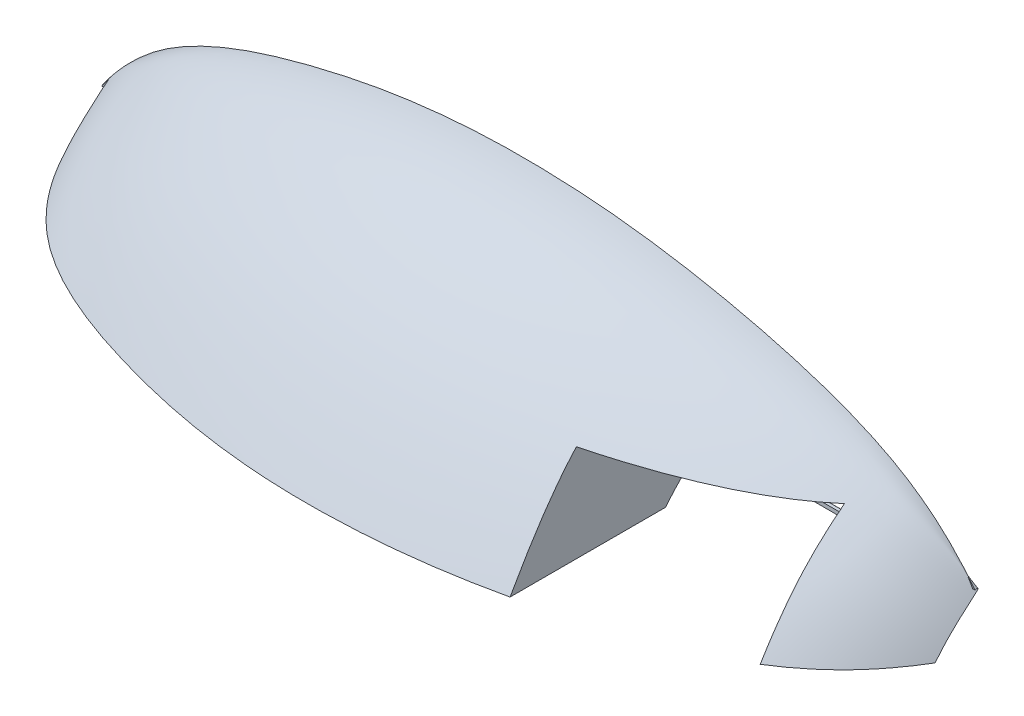
ISO-10303-21;
HEADER;
FILE_DESCRIPTION(('STEP AP214'),'2;1');
FILE_NAME('part.step','',(''),(''),'','','');
FILE_SCHEMA(('AUTOMOTIVE_DESIGN { 1 0 10303 214 1 1 1 1 }'));
ENDSEC;
DATA;
#1=APPLICATION_CONTEXT('core data for automotive mechanical design processes');
#2=APPLICATION_PROTOCOL_DEFINITION('international standard','automotive_design',2000,#1);
#3=PRODUCT_CONTEXT('',#1,'mechanical');
#4=PRODUCT('Part','Part','',(#3));
#5=PRODUCT_RELATED_PRODUCT_CATEGORY('part','',(#4));
#6=PRODUCT_DEFINITION_FORMATION('','',#4);
#7=PRODUCT_DEFINITION_CONTEXT('part definition',#1,'design');
#8=PRODUCT_DEFINITION('design','',#6,#7);
#9=PRODUCT_DEFINITION_SHAPE('','',#8);
#10=(LENGTH_UNIT() NAMED_UNIT(*) SI_UNIT(.MILLI.,.METRE.));
#11=(NAMED_UNIT(*) PLANE_ANGLE_UNIT() SI_UNIT($,.RADIAN.));
#12=(NAMED_UNIT(*) SI_UNIT($,.STERADIAN.) SOLID_ANGLE_UNIT());
#13=UNCERTAINTY_MEASURE_WITH_UNIT(LENGTH_MEASURE(1.E-05),#10,'distance_accuracy_value','');
#14=(GEOMETRIC_REPRESENTATION_CONTEXT(3) GLOBAL_UNCERTAINTY_ASSIGNED_CONTEXT((#13)) GLOBAL_UNIT_ASSIGNED_CONTEXT((#10,
#11,#12)) REPRESENTATION_CONTEXT('',''));
#15=CARTESIAN_POINT('',(0.,0.,0.));
#16=DIRECTION('',(0.,0.,1.));
#17=DIRECTION('',(1.,0.,0.));
#18=AXIS2_PLACEMENT_3D('',#15,#16,#17);
#19=CARTESIAN_POINT('',(20.25011525,25.453580483249,42.));
#20=DIRECTION('',(0.,0.,-1.));
#21=DIRECTION('',(-1.,0.,0.));
#22=AXIS2_PLACEMENT_3D('',#19,#20,#21);
#23=PLANE('',#22);
#24=DIRECTION('',(-1.,0.,0.));
#25=VECTOR('',#24,1.);
#26=CARTESIAN_POINT('',(36.5,24.5,42.));
#27=LINE('',#26,#25);
#28=CARTESIAN_POINT('',(36.5,24.5,42.));
#29=VERTEX_POINT('',#28);
#30=CARTESIAN_POINT('',(28.,24.5,42.));
#31=VERTEX_POINT('',#30);
#32=EDGE_CURVE('E36',#29,#31,#27,.T.);
#33=ORIENTED_EDGE('',*,*,#32,.T.);
#34=DIRECTION('',(0.,-1.,0.));
#35=VECTOR('',#34,1.);
#36=CARTESIAN_POINT('',(28.,24.5,42.));
#37=LINE('',#36,#35);
#38=CARTESIAN_POINT('',(28.,22.,42.));
#39=VERTEX_POINT('',#38);
#40=EDGE_CURVE('E95',#31,#39,#37,.T.);
#41=ORIENTED_EDGE('',*,*,#40,.T.);
#42=CARTESIAN_POINT('',(0.000230500000000689,22.,42.));
#43=CARTESIAN_POINT('',(13.5001536666667,22.,42.));
#44=CARTESIAN_POINT('',(27.0000768333334,22.,42.));
#45=CARTESIAN_POINT('',(40.5,22.,42.));
#46=B_SPLINE_CURVE_WITH_KNOTS('',3,(#42,#43,#44,#45),.UNSPECIFIED.,.F.,.F.,(4,4),(0.,1.),.UNSPECIFIED.);
#47=CARTESIAN_POINT('',(0.000230500000000689,22.,42.));
#48=VERTEX_POINT('',#47);
#49=EDGE_CURVE('E242',#48,#39,#46,.T.);
#50=ORIENTED_EDGE('',*,*,#49,.F.);
#51=CARTESIAN_POINT('',(40.5,22.,42.));
#52=CARTESIAN_POINT('',(39.5504796655932,23.244792146525,42.));
#53=CARTESIAN_POINT('',(36.7942535663366,25.8303513659763,42.));
#54=CARTESIAN_POINT('',(28.4856403512339,28.2163806083618,42.));
#55=CARTESIAN_POINT('',(19.7044952136281,29.2399964366831,42.));
#56=CARTESIAN_POINT('',(11.4702662698805,28.4720776969719,42.));
#57=CARTESIAN_POINT('',(3.12649338618059,25.6439685121812,42.));
#58=CARTESIAN_POINT('',(0.739150769022203,23.03726321863,42.));
#59=CARTESIAN_POINT('',(0.000230500000000689,22.,42.));
#60=B_SPLINE_CURVE_WITH_KNOTS('',3,(#51,#52,#53,#54,#55,#56,#57,#58,#59),.UNSPECIFIED.,.F.,.F.,
(4,1,1,1,1,1,4),(0.,0.118232225960158,0.285413594584941,0.470487289443813,0.74940048760547,
0.912101409043602,1.),.UNSPECIFIED.);
#61=CARTESIAN_POINT('',(40.5,22.,42.));
#62=VERTEX_POINT('',#61);
#63=EDGE_CURVE('E254',#62,#48,#60,.T.);
#64=ORIENTED_EDGE('',*,*,#63,.F.);
#65=CARTESIAN_POINT('',(0.000230500000000689,22.,42.));
#66=CARTESIAN_POINT('',(13.5001536666667,22.,42.));
#67=CARTESIAN_POINT('',(27.0000768333334,22.,42.));
#68=CARTESIAN_POINT('',(40.5,22.,42.));
#69=B_SPLINE_CURVE_WITH_KNOTS('',3,(#65,#66,#67,#68),.UNSPECIFIED.,.F.,.F.,(4,4),(0.,1.),.UNSPECIFIED.);
#70=CARTESIAN_POINT('',(36.5,22.,42.));
#71=VERTEX_POINT('',#70);
#72=EDGE_CURVE('E228',#71,#62,#69,.T.);
#73=ORIENTED_EDGE('',*,*,#72,.F.);
#74=DIRECTION('',(0.,-1.,0.));
#75=VECTOR('',#74,1.);
#76=CARTESIAN_POINT('',(36.5,24.5,42.));
#77=LINE('',#76,#75);
#78=EDGE_CURVE('E115',#29,#71,#77,.T.);
#79=ORIENTED_EDGE('',*,*,#78,.F.);
#80=EDGE_LOOP('',(#33,#41,#50,#64,#73,#79));
#81=FACE_BOUND('',#80,.T.);
#82=ADVANCED_FACE('F17',(#81),#23,.T.);
#83=CARTESIAN_POINT('',(0.,20.,12.));
#84=DIRECTION('',(0.,1.,0.));
#85=DIRECTION('',(0.,0.,-1.));
#86=AXIS2_PLACEMENT_3D('',#83,#84,#85);
#87=PLANE('',#86);
#88=DIRECTION('',(1.,0.,0.));
#89=VECTOR('',#88,1.);
#90=CARTESIAN_POINT('',(20.2501152496914,20.,43.8493692487917));
#91=LINE('',#90,#89);
#92=CARTESIAN_POINT('',(28.,20.,43.8493692519278));
#93=VERTEX_POINT('',#92);
#94=CARTESIAN_POINT('',(0.000230497181969574,20.,43.8493692487917));
#95=VERTEX_POINT('',#94);
#96=EDGE_CURVE('E310',#93,#95,#91,.F.);
#97=ORIENTED_EDGE('',*,*,#96,.F.);
#98=DIRECTION('',(0.,0.,1.));
#99=VECTOR('',#98,1.);
#100=CARTESIAN_POINT('',(28.,20.,42.));
#101=LINE('',#100,#99);
#102=CARTESIAN_POINT('',(28.,20.,51.0596281540542));
#103=VERTEX_POINT('',#102);
#104=EDGE_CURVE('E126',#93,#103,#101,.T.);
#105=ORIENTED_EDGE('',*,*,#104,.T.);
#106=CARTESIAN_POINT('',(20.2499996759147,20.0000000013567,52.0000000049307));
#107=CARTESIAN_POINT('',(20.4135696746412,20.0000000004872,51.9967497914983));
#108=CARTESIAN_POINT('',(20.5771180638886,20.0000000001306,51.9924559585666));
#109=CARTESIAN_POINT('',(20.9041414794619,19.9999999998694,51.9818220456582));
#110=CARTESIAN_POINT('',(21.0676165085924,19.999999999965,51.9754820520442));
#111=CARTESIAN_POINT('',(21.394080035644,20.0000000000349,51.9608143578874));
#112=CARTESIAN_POINT('',(21.5570687510992,20.0000000000096,51.9524915211889));
#113=CARTESIAN_POINT('',(21.8829352655506,19.9999999999904,51.9337950110099));
#114=CARTESIAN_POINT('',(22.045813058499,19.9999999999964,51.9234212334876));
#115=CARTESIAN_POINT('',(22.6443034734853,20.0000000000097,51.8814582921747));
#116=CARTESIAN_POINT('',(23.0794874533759,20.0000000000026,51.8434524485877));
#117=CARTESIAN_POINT('',(23.9483532892997,19.9999999999974,51.7523037645477));
#118=CARTESIAN_POINT('',(24.3820347921042,19.9999999999993,51.6991575806347));
#119=CARTESIAN_POINT('',(25.2473626601567,20.0000000000007,51.5780378677264));
#120=CARTESIAN_POINT('',(25.6790088157183,20.0000000000002,51.5100628437112));
#121=CARTESIAN_POINT('',(26.5429974773256,19.9999999999998,51.3594301739964));
#122=CARTESIAN_POINT('',(26.9753218060837,20.,51.2766683392817));
#123=CARTESIAN_POINT('',(27.6216923645903,20.,51.1425168358771));
#124=CARTESIAN_POINT('',(27.8367919615758,20.,51.0961326472616));
#125=CARTESIAN_POINT('',(28.2662774748216,20.,51.0001565027755));
#126=CARTESIAN_POINT('',(28.4806633860763,20.,50.9505645244564));
#127=CARTESIAN_POINT('',(28.9086688754122,20.,50.8483505978863));
#128=CARTESIAN_POINT('',(29.1222885877608,20.,50.7957292111368));
#129=CARTESIAN_POINT('',(29.5487597240877,20.,50.6874701461041));
#130=CARTESIAN_POINT('',(29.7616111554705,20.,50.6318324969737));
#131=CARTESIAN_POINT('',(30.2960050616216,20.,50.487739101054));
#132=CARTESIAN_POINT('',(30.6169789561417,20.,50.3971586821497));
#133=CARTESIAN_POINT('',(31.2564301196012,20.,50.2075895642107));
#134=CARTESIAN_POINT('',(31.5749074742918,20.,50.1086011553682));
#135=CARTESIAN_POINT('',(32.2089280712393,20.,49.9010385501576));
#136=CARTESIAN_POINT('',(32.5244696365589,20.,49.7924592073451));
#137=CARTESIAN_POINT('',(33.1520803241271,20.,49.5642134618928));
#138=CARTESIAN_POINT('',(33.4641434940165,20.,49.4445305908881));
#139=CARTESIAN_POINT('',(34.0794529422012,20.,49.1939929876819));
#140=CARTESIAN_POINT('',(34.382759943791,20.,49.0632880839233));
#141=CARTESIAN_POINT('',(34.9827262165219,20.,48.7874415991884));
#142=CARTESIAN_POINT('',(35.2793871648631,20.,48.642303711976));
#143=CARTESIAN_POINT('',(35.7173590814869,20.,48.4119429065106));
#144=CARTESIAN_POINT('',(35.8620510940372,20.,48.3331245702984));
#145=CARTESIAN_POINT('',(36.1488126549921,20.,48.1708326440661));
#146=CARTESIAN_POINT('',(36.2908821824665,20.,48.0873590169129));
#147=CARTESIAN_POINT('',(36.5717250266479,20.,47.9154631703518));
#148=CARTESIAN_POINT('',(36.7105027599516,20.,47.8270481865198));
#149=CARTESIAN_POINT('',(36.9843642019698,20.,47.6446757523775));
#150=CARTESIAN_POINT('',(37.1194481985438,20.,47.5507187357799));
#151=CARTESIAN_POINT('',(37.3440146505783,20.,47.3874348648052));
#152=CARTESIAN_POINT('',(37.434567794721,20.,47.3195760319221));
#153=CARTESIAN_POINT('',(37.6136503259639,20.,47.1812446132004));
#154=CARTESIAN_POINT('',(37.7021797473371,20.,47.11077207168));
#155=CARTESIAN_POINT('',(37.9646618185038,20.,46.8954065446225));
#156=CARTESIAN_POINT('',(38.1354428078512,20.,46.7466131871385));
#157=CARTESIAN_POINT('',(38.4678317330362,20.,46.4390948371949));
#158=CARTESIAN_POINT('',(38.6294386012121,19.9999999999999,46.2803686932826));
#159=CARTESIAN_POINT('',(38.9430810707587,20.0000000000001,45.953570352726));
#160=CARTESIAN_POINT('',(39.0951117168919,20.0000000000003,45.7854934008313));
#161=CARTESIAN_POINT('',(39.3892421629384,19.9999999999997,45.4409125191117));
#162=CARTESIAN_POINT('',(39.5313430951607,19.999999999999,45.2644095540016));
#163=CARTESIAN_POINT('',(39.8055523366811,20.000000000001,44.9039472757448));
#164=CARTESIAN_POINT('',(39.9376655491683,20.0000000000037,44.7199916902775));
#165=CARTESIAN_POINT('',(40.1409119593444,19.9999999999978,44.4209696077206));
#166=CARTESIAN_POINT('',(40.2151684471049,19.9999999999932,44.3080086183198));
#167=CARTESIAN_POINT('',(40.3601614020383,20.0000000000068,44.0801467760643));
#168=CARTESIAN_POINT('',(40.4309042188433,20.0000000000248,43.9652499653502));
#169=CARTESIAN_POINT('',(40.4999999996914,20.0000000000678,43.849369255064));
#170=B_SPLINE_CURVE_WITH_KNOTS('',3,(#106,#107,#108,#109,#110,#111,#112,#113,#114,#115,#116,
#117,#118,#119,#120,#121,#122,#123,#124,#125,#126,#127,#128,#129,#130,#131,#132,#133,#134,#135,
#136,#137,#138,#139,#140,#141,#142,#143,#144,#145,#146,#147,#148,#149,#150,#151,#152,#153,#154,
#155,#156,#157,#158,#159,#160,#161,#162,#163,#164,#165,#166,#167,#168,#169),.UNSPECIFIED.,.F.,
.F.,(4,2,2,2,2,2,2,2,2,2,2,2,2,2,2,2,2,2,2,2,2,2,2,2,2,2,2,2,2,2,2,4),(0.,0.490802083132261,
0.981583453588453,1.4711731299124,1.96078764890766,3.27101832903677,4.58153857361369,
5.89219100385777,7.21247135862331,7.87258316302662,8.53269958744197,9.19269405059586,
9.85268213590522,10.8531062033214,11.8534957562505,12.8544254123247,13.856864097763,
14.8473784102302,15.8376398743658,16.3318703758224,16.8261048200745,17.3196336149218,
17.8131238379323,18.1525511005949,18.4919726105563,19.1710579572135,19.8502221728125,
20.5297349843316,21.2091701825019,21.8882696354775,22.2937624549635,22.6984936428757),.UNSPECIFIED.);
#171=CARTESIAN_POINT('',(20.2540061646727,19.9999915980269,51.9999847320657));
#172=VERTEX_POINT('',#171);
#173=EDGE_CURVE('E277',#103,#172,#170,.F.);
#174=ORIENTED_EDGE('',*,*,#173,.T.);
#175=CARTESIAN_POINT('',(0.000230499716088509,16.6736548785001,45.9554175751034));
#176=CARTESIAN_POINT('',(0.739150768497569,17.1737420851977,46.8641682399041));
#177=CARTESIAN_POINT('',(3.12649338505101,18.4304915250546,49.1479137020203));
#178=CARTESIAN_POINT('',(11.4702662680946,19.7939846074181,51.6256320448502));
#179=CARTESIAN_POINT('',(19.704495211664,20.1642149708474,52.2984088813494));
#180=CARTESIAN_POINT('',(28.4856403495073,19.6707074695508,51.401614754483));
#181=CARTESIAN_POINT('',(36.7942535651638,18.5203507651671,49.3112045102972));
#182=CARTESIAN_POINT('',(39.5504796650203,17.273796309124,47.0459852136063));
#183=CARTESIAN_POINT('',(40.4999999997161,16.6736548830317,45.9554175833377));
#184=B_SPLINE_CURVE_WITH_KNOTS('',3,(#175,#176,#177,#178,#179,#180,#181,#182,#183),
.UNSPECIFIED.,.F.,.F.,(4,1,1,1,1,1,4),(0.,0.087898590956398,0.25059951239453,0.529512710556187,
0.714586405415059,0.881767774039842,1.),.UNSPECIFIED.);
#185=CARTESIAN_POINT('',(20.2499994144646,20.000008266416,52.0000150216021));
#186=VERTEX_POINT('',#185);
#187=EDGE_CURVE('E296',#172,#186,#184,.F.);
#188=ORIENTED_EDGE('',*,*,#187,.T.);
#189=DIRECTION('',(-1.,0.,0.));
#190=VECTOR('',#189,1.);
#191=CARTESIAN_POINT('',(40.5,20.,52.));
#192=LINE('',#191,#190);
#193=CARTESIAN_POINT('',(18.7835165493222,20.,52.));
#194=VERTEX_POINT('',#193);
#195=EDGE_CURVE('E185',#186,#194,#192,.T.);
#196=ORIENTED_EDGE('',*,*,#195,.T.);
#197=CARTESIAN_POINT('',(0.000230499691400271,20.0000000001187,43.8493692422752));
#198=CARTESIAN_POINT('',(0.0968054574181439,20.0000000000429,44.0227701845247));
#199=CARTESIAN_POINT('',(0.19661560293333,20.0000000000115,44.1943989615023));
#200=CARTESIAN_POINT('',(0.403397344412526,19.9999999999884,44.5339714085741));
#201=CARTESIAN_POINT('',(0.510389067584049,19.9999999999967,44.7019028071633));
#202=CARTESIAN_POINT('',(0.74366612102853,20.0000000000036,45.0508708897581));
#203=CARTESIAN_POINT('',(0.870785335727647,20.000000000001,45.2313529319335));
#204=CARTESIAN_POINT('',(1.13447983678024,19.999999999999,45.5853728902618));
#205=CARTESIAN_POINT('',(1.2710578603763,19.9999999999997,45.7589087731777));
#206=CARTESIAN_POINT('',(1.55390028108398,20.0000000000003,46.0978400677537));
#207=CARTESIAN_POINT('',(1.70016216897266,20.0000000000001,46.2632375689683));
#208=CARTESIAN_POINT('',(2.00231310557232,19.9999999999999,46.5845543006511));
#209=CARTESIAN_POINT('',(2.15818683469796,20.,46.7404878660588));
#210=CARTESIAN_POINT('',(2.39923233798985,20.,46.966653896673));
#211=CARTESIAN_POINT('',(2.48079624186092,20.,47.0407614236449));
#212=CARTESIAN_POINT('',(2.64630715917477,20.,47.1862707033638));
#213=CARTESIAN_POINT('',(2.73025416837889,20.,47.2576724609228));
#214=CARTESIAN_POINT('',(2.90035286327407,20.,47.3978067476822));
#215=CARTESIAN_POINT('',(2.98650468371042,20.,47.4665391130955));
#216=CARTESIAN_POINT('',(3.16081369194877,20.,47.6014075947693));
#217=CARTESIAN_POINT('',(3.24897090450148,20.,47.6675436789587));
#218=CARTESIAN_POINT('',(3.51873052954396,20.,47.8640268703432));
#219=CARTESIAN_POINT('',(3.70319722590761,20.,47.990463361658));
#220=CARTESIAN_POINT('',(4.0784207412309,20.,48.2337572998735));
#221=CARTESIAN_POINT('',(4.26918046570282,20.,48.3506102327003));
#222=CARTESIAN_POINT('',(4.65593172761846,20.,48.5755220889876));
#223=CARTESIAN_POINT('',(4.85192591195376,20.,48.6835764470487));
#224=CARTESIAN_POINT('',(5.24811020294785,20.,48.8915835274849));
#225=CARTESIAN_POINT('',(5.44829964198088,20.,48.9915375267988));
#226=CARTESIAN_POINT('',(5.85479183546584,20.,49.1853697493704));
#227=CARTESIAN_POINT('',(6.06114025297253,20.,49.2791518843283));
#228=CARTESIAN_POINT('',(6.47667009855311,20.,49.4598880855516));
#229=CARTESIAN_POINT('',(6.68585002941654,20.,49.5468456068719));
#230=CARTESIAN_POINT('',(7.10663958435005,20.,49.7146864317225));
#231=CARTESIAN_POINT('',(7.31824935329984,20.,49.7955693708633));
#232=CARTESIAN_POINT('',(7.74352382423458,20.,49.9519338687696));
#233=CARTESIAN_POINT('',(7.95718916212183,20.,50.0274136908321));
#234=CARTESIAN_POINT('',(8.46348647151599,20.,50.1999144380408));
#235=CARTESIAN_POINT('',(8.75681544455025,20.,50.2948904730871));
#236=CARTESIAN_POINT('',(9.19855335928451,20.,50.4318169607233));
#237=CARTESIAN_POINT('',(9.34611380961829,20.,50.4765429049414));
#238=CARTESIAN_POINT('',(9.64173131650181,20.,50.5643258119592));
#239=CARTESIAN_POINT('',(9.78978837156634,20.,50.6073827797455));
#240=CARTESIAN_POINT('',(10.0864275836054,20.,50.6917853473253));
#241=CARTESIAN_POINT('',(10.235009856952,20.,50.7331305381955));
#242=CARTESIAN_POINT('',(10.5326543868108,20.,50.8140517367445));
#243=CARTESIAN_POINT('',(10.6817166425207,20.,50.8536277473794));
#244=CARTESIAN_POINT('',(11.1296271508575,20.,50.9696357833914));
#245=CARTESIAN_POINT('',(11.4291866773501,20.,51.0433442580629));
#246=CARTESIAN_POINT('',(12.0300653756806,20.,51.1831356639743));
#247=CARTESIAN_POINT('',(12.3313844721009,20.,51.2492189195574));
#248=CARTESIAN_POINT('',(12.9356356389751,20.,51.3734430444445));
#249=CARTESIAN_POINT('',(13.2385675873632,20.,51.431584506174));
#250=CARTESIAN_POINT('',(13.8306128135457,20.,51.5369486507701));
#251=CARTESIAN_POINT('',(14.1196545285057,20.,51.5845735049844));
#252=CARTESIAN_POINT('',(14.6988398360051,20.,51.6722542257451));
#253=CARTESIAN_POINT('',(14.9889832530848,20.,51.7123112499061));
#254=CARTESIAN_POINT('',(15.5701877166188,20.,51.784759412013));
#255=CARTESIAN_POINT('',(15.8612486397586,20.,51.8171515390563));
#256=CARTESIAN_POINT('',(16.4440972396431,20.,51.874249569198));
#257=CARTESIAN_POINT('',(16.7358848494747,20.,51.8989561553886));
#258=CARTESIAN_POINT('',(17.3199872683331,20.,51.9407356879203));
#259=CARTESIAN_POINT('',(17.6123020455568,20.,51.9578090802453));
#260=CARTESIAN_POINT('',(18.1972543751203,20.,51.9844756855724));
#261=CARTESIAN_POINT('',(18.4898919054113,20.,51.9940693812599));
#262=CARTESIAN_POINT('',(18.7825989838568,20.,51.9999999896905));
#263=B_SPLINE_CURVE_WITH_KNOTS('',3,(#197,#198,#199,#200,#201,#202,#203,#204,#205,#206,#207,
#208,#209,#210,#211,#212,#213,#214,#215,#216,#217,#218,#219,#220,#221,#222,#223,#224,#225,#226,
#227,#228,#229,#230,#231,#232,#233,#234,#235,#236,#237,#238,#239,#240,#241,#242,#243,#244,#245,
#246,#247,#248,#249,#250,#251,#252,#253,#254,#255,#256,#257,#258,#259,#260,#261,#262),
.UNSPECIFIED.,.F.,.F.,(4,2,2,2,2,2,2,2,2,2,2,2,2,2,2,2,2,2,2,2,2,2,2,2,2,2,2,2,2,2,2,2,4),(0.,
0.59544499597196,1.19263473793595,1.8546102223042,2.51677807979466,3.17877502689578,
3.8397428520501,4.17030115964499,4.50085887933667,4.83143684927192,5.16201890144312,
5.83256820086974,6.50343155167097,7.17464081040931,7.84574405320231,8.52558795630373,
9.2050854285547,9.88462362859726,10.5643792782317,11.4892091908595,11.9517721093825,
12.4143336457536,12.8770050523883,13.339675685918,14.265055835568,15.1903966091216,
16.1156683182796,16.9943879264017,17.8729730119724,18.7514446608301,19.6298382086507,
20.5081804279195,21.3864659606422),.UNSPECIFIED.);
#264=EDGE_CURVE('E276',#194,#95,#263,.F.);
#265=ORIENTED_EDGE('',*,*,#264,.T.);
#266=EDGE_LOOP('',(#97,#105,#174,#188,#196,#265));
#267=FACE_BOUND('',#266,.T.);
#268=ADVANCED_FACE('F303',(#267),#87,.F.);
#269=CARTESIAN_POINT('',(20.2501152489146,18.3387013083919,48.9811139533019));
#270=DIRECTION('',(0.,0.876104202220531,-0.482121796698228));
#271=DIRECTION('',(-1.,-1.11891773624251E-10,-2.0331852867983E-10));
#272=AXIS2_PLACEMENT_3D('',#269,#270,#271);
#273=PLANE('',#272);
#274=CARTESIAN_POINT('',(0.000230499716088509,16.6736548785001,45.9554175751034));
#275=CARTESIAN_POINT('',(0.739150768497569,17.1737420851977,46.8641682399041));
#276=CARTESIAN_POINT('',(3.12649338505101,18.4304915250546,49.1479137020203));
#277=CARTESIAN_POINT('',(11.4702662680946,19.7939846074181,51.6256320448502));
#278=CARTESIAN_POINT('',(19.704495211664,20.1642149708474,52.2984088813494));
#279=CARTESIAN_POINT('',(28.4856403495073,19.6707074695508,51.401614754483));
#280=CARTESIAN_POINT('',(36.7942535651638,18.5203507651671,49.3112045102972));
#281=CARTESIAN_POINT('',(39.5504796650203,17.273796309124,47.0459852136063));
#282=CARTESIAN_POINT('',(40.4999999997161,16.6736548830317,45.9554175833377));
#283=B_SPLINE_CURVE_WITH_KNOTS('',3,(#274,#275,#276,#277,#278,#279,#280,#281,#282),
.UNSPECIFIED.,.F.,.F.,(4,1,1,1,1,1,4),(0.,0.087898590956398,0.25059951239453,0.529512710556187,
0.714586405415059,0.881767774039842,1.),.UNSPECIFIED.);
#284=EDGE_CURVE('E255',#194,#186,#283,.T.);
#285=ORIENTED_EDGE('',*,*,#284,.F.);
#286=ORIENTED_EDGE('',*,*,#195,.F.);
#287=EDGE_LOOP('',(#285,#286));
#288=FACE_BOUND('',#287,.T.);
#289=ADVANCED_FACE('F19',(#288),#273,.F.);
#290=CARTESIAN_POINT('',(0.000230500000000689,22.,42.));
#291=CARTESIAN_POINT('',(0.000230500000000652,22.,41.9948388900879));
#292=CARTESIAN_POINT('',(0.000230500163543397,22.1160702352584,41.6051916335395));
#293=CARTESIAN_POINT('',(0.000230499507954534,21.2652746975059,42.7053325517347));
#294=CARTESIAN_POINT('',(0.000230499770870856,19.8719744469128,44.0768283929599));
#295=CARTESIAN_POINT('',(0.000230499716082116,17.8853002770691,45.2886468245025));
#296=CARTESIAN_POINT('',(0.000230499716088509,16.6736548785001,45.9554175751034));
#297=CARTESIAN_POINT('',(13.5001536666667,22.,42.));
#298=CARTESIAN_POINT('',(13.5001536666667,22.,41.9948388928607));
#299=CARTESIAN_POINT('',(13.5001536668302,22.1160702342329,41.6051916397552));
#300=CARTESIAN_POINT('',(13.5001536661746,21.2652746983509,42.7053325555318));
#301=CARTESIAN_POINT('',(13.5001536664375,19.8719744494963,44.0768283950455));
#302=CARTESIAN_POINT('',(13.5001536663827,17.8853002785015,45.2886468272902));
#303=CARTESIAN_POINT('',(13.5001536663828,16.6736548800107,45.9554175778481));
#304=CARTESIAN_POINT('',(27.0000768333334,22.,42.));
#305=CARTESIAN_POINT('',(27.0000768333334,22.,41.9948388956336));
#306=CARTESIAN_POINT('',(27.0000768334969,22.1160702332072,41.6051916459709));
#307=CARTESIAN_POINT('',(27.0000768328413,21.2652746991957,42.7053325593288));
#308=CARTESIAN_POINT('',(27.0000768331042,19.8719744520799,44.0768283971311));
#309=CARTESIAN_POINT('',(27.0000768330494,17.885300279934,45.2886468300779));
#310=CARTESIAN_POINT('',(27.0000768330494,16.6736548815212,45.9554175805929));
#311=CARTESIAN_POINT('',(40.5,22.,42.));
#312=CARTESIAN_POINT('',(40.5,22.,41.9948388984064));
#313=CARTESIAN_POINT('',(40.5000000001636,22.1160702321816,41.6051916521867));
#314=CARTESIAN_POINT('',(40.4999999995079,21.2652747000406,42.7053325631259));
#315=CARTESIAN_POINT('',(40.4999999997708,19.8719744546634,44.0768283992168));
#316=CARTESIAN_POINT('',(40.4999999997161,17.8853002813665,45.2886468328657));
#317=CARTESIAN_POINT('',(40.4999999997161,16.6736548830317,45.9554175833377));
#318=B_SPLINE_SURFACE_WITH_KNOTS('',3,3,((#290,#291,#292,#293,#294,#295,#296),(#297,#298,#299,
#300,#301,#302,#303),(#304,#305,#306,#307,#308,#309,#310),(#311,#312,#313,#314,#315,#316,#317)),
.UNSPECIFIED.,.F.,.F.,.F.,(4,4),(4,1,1,1,4),(0.,1.),(0.,0.251024544191798,0.502049088383596,
0.789400842037647,1.),.UNSPECIFIED.);
#319=DIRECTION('',(1.,0.,0.));
#320=VECTOR('',#319,1.);
#321=CARTESIAN_POINT('',(20.2501152499384,21.8271332074617,41.9999999999972));
#322=LINE('',#321,#320);
#323=CARTESIAN_POINT('',(36.5,21.8271332074617,42.));
#324=VERTEX_POINT('',#323);
#325=CARTESIAN_POINT('',(28.,21.8271332074617,42.));
#326=VERTEX_POINT('',#325);
#327=EDGE_CURVE('E11',#324,#326,#322,.F.);
#328=CARTESIAN_POINT('',(28.,21.8271332099329,42.));
#329=CARTESIAN_POINT('',(28.,21.8128782732778,42.0157407648511));
#330=CARTESIAN_POINT('',(28.,21.7987474599328,42.0315921023192));
#331=CARTESIAN_POINT('',(28.,21.7706562873714,42.0634439358529));
#332=CARTESIAN_POINT('',(28.,21.7566959196322,42.0794444243893));
#333=CARTESIAN_POINT('',(28.,21.7149562268739,42.1275588052288));
#334=CARTESIAN_POINT('',(28.,21.6873137112087,42.1597907965044));
#335=CARTESIAN_POINT('',(28.,21.6321354739692,42.2243079644472));
#336=CARTESIAN_POINT('',(28.,21.6045996928564,42.2565930904632));
#337=CARTESIAN_POINT('',(28.,21.549474517407,42.3211241421989));
#338=CARTESIAN_POINT('',(28.,21.5218851170072,42.3533700627234));
#339=CARTESIAN_POINT('',(28.,21.4184539694683,42.4737061713376));
#340=CARTESIAN_POINT('',(28.,21.3421367508642,42.5613919989329));
#341=CARTESIAN_POINT('',(28.,21.1873286204282,42.7348281201358));
#342=CARTESIAN_POINT('',(28.,21.1088378418642,42.8205785318271));
#343=CARTESIAN_POINT('',(28.,20.9490418374781,42.9893857523519));
#344=CARTESIAN_POINT('',(28.,20.8677373078765,43.0724432178012));
#345=CARTESIAN_POINT('',(28.,20.7019766398885,43.2357364883653));
#346=CARTESIAN_POINT('',(28.,20.6175137729919,43.3159654680112));
#347=CARTESIAN_POINT('',(28.,20.4457213498983,43.4733924526511));
#348=CARTESIAN_POINT('',(28.,20.3583901109788,43.5505886179622));
#349=CARTESIAN_POINT('',(28.,20.181082448173,43.7021222546609));
#350=CARTESIAN_POINT('',(28.,20.0911027229197,43.7764558663558));
#351=CARTESIAN_POINT('',(28.,20.,43.849369251213));
#352=B_SPLINE_CURVE_WITH_KNOTS('',3,(#328,#329,#330,#331,#332,#333,#334,#335,#336,#337,#338,
#339,#340,#341,#342,#343,#344,#345,#346,#347,#348,#349,#350,#351),.UNSPECIFIED.,.F.,.F.,(4,2,2,
2,2,2,2,2,2,2,2,4),(0.,0.0637059523011469,0.127408705971284,0.254793421762433,0.382092066684013,
0.509406058250785,0.858123549760446,1.20681970743021,1.55543019381533,1.90483118819218,
2.2544409533805,2.60450668857241),.UNSPECIFIED.);
#353=EDGE_CURVE('E178',#326,#93,#352,.T.);
#354=CARTESIAN_POINT('',(0.000230500000000689,22.,42.));
#355=CARTESIAN_POINT('',(0.000230500000000652,22.,41.9948388900879));
#356=CARTESIAN_POINT('',(0.000230500163543397,22.1160702352584,41.6051916335395));
#357=CARTESIAN_POINT('',(0.000230499507954534,21.2652746975059,42.7053325517347));
#358=CARTESIAN_POINT('',(0.000230499770870856,19.8719744469128,44.0768283929599));
#359=CARTESIAN_POINT('',(0.000230499716082116,17.8853002770691,45.2886468245025));
#360=CARTESIAN_POINT('',(0.000230499716088509,16.6736548785001,45.9554175751034));
#361=B_SPLINE_CURVE_WITH_KNOTS('',3,(#354,#355,#356,#357,#358,#359,#360),.UNSPECIFIED.,.F.,.F.,
(4,1,1,1,4),(0.,0.251024544191798,0.502049088383596,0.789400842037647,1.),.UNSPECIFIED.);
#362=EDGE_CURVE('E247',#48,#95,#361,.T.);
#363=CARTESIAN_POINT('',(0.000230500000000689,22.,42.));
#364=CARTESIAN_POINT('',(13.5001536666667,22.,42.));
#365=CARTESIAN_POINT('',(27.0000768333334,22.,42.));
#366=CARTESIAN_POINT('',(40.5,22.,42.));
#367=B_SPLINE_CURVE_WITH_KNOTS('',3,(#363,#364,#365,#366),.UNSPECIFIED.,.F.,.F.,(4,4),(0.,1.),.UNSPECIFIED.);
#368=EDGE_CURVE('E221',#39,#71,#367,.T.);
#369=CARTESIAN_POINT('',(40.5,22.,42.));
#370=CARTESIAN_POINT('',(40.5,22.,41.9948388984064));
#371=CARTESIAN_POINT('',(40.5000000001636,22.1160702321816,41.6051916521867));
#372=CARTESIAN_POINT('',(40.4999999995079,21.2652747000406,42.7053325631259));
#373=CARTESIAN_POINT('',(40.4999999997708,19.8719744546634,44.0768283992168));
#374=CARTESIAN_POINT('',(40.4999999997161,17.8853002813665,45.2886468328657));
#375=CARTESIAN_POINT('',(40.4999999997161,16.6736548830317,45.9554175833377));
#376=B_SPLINE_CURVE_WITH_KNOTS('',3,(#369,#370,#371,#372,#373,#374,#375),.UNSPECIFIED.,.F.,.F.,
(4,1,1,1,4),(0.,0.251024544191798,0.502049088383596,0.789400842037647,1.),.UNSPECIFIED.);
#377=CARTESIAN_POINT('',(40.5,20.,43.849369255064));
#378=VERTEX_POINT('',#377);
#379=EDGE_CURVE('E267',#378,#62,#376,.F.);
#380=CARTESIAN_POINT('',(36.5,20.,43.8493692519278));
#381=VERTEX_POINT('',#380);
#382=EDGE_CURVE('E339',#378,#381,#91,.F.);
#383=CARTESIAN_POINT('',(36.5,19.9999999994958,43.8493692542721));
#384=CARTESIAN_POINT('',(36.5,20.0843239913893,43.7818768376772));
#385=CARTESIAN_POINT('',(36.5,20.1676877510825,43.7131716880926));
#386=CARTESIAN_POINT('',(36.5,20.3322817832901,43.5732122807683));
#387=CARTESIAN_POINT('',(36.5,20.4135115139621,43.5019573862764));
#388=CARTESIAN_POINT('',(36.5,20.5733451414434,43.357023299949));
#389=CARTESIAN_POINT('',(36.5,20.6519560928481,43.2833519001543));
#390=CARTESIAN_POINT('',(36.5,20.806647741807,43.1334004753126));
#391=CARTESIAN_POINT('',(36.5,20.8827284796048,43.0571204917948));
#392=CARTESIAN_POINT('',(36.5,21.0080461423206,42.9273667920294));
#393=CARTESIAN_POINT('',(36.5,21.0579634676359,42.8745473610282));
#394=CARTESIAN_POINT('',(36.5,21.1567672037968,42.7679427904414));
#395=CARTESIAN_POINT('',(36.5,21.2056534966466,42.7141575416136));
#396=CARTESIAN_POINT('',(36.5,21.3025849727241,42.6058156254657));
#397=CARTESIAN_POINT('',(36.5,21.3506299709092,42.5512587930898));
#398=CARTESIAN_POINT('',(36.5,21.446229945371,42.4414372319697));
#399=CARTESIAN_POINT('',(36.5,21.4937830674184,42.3861708944385));
#400=CARTESIAN_POINT('',(36.5,21.5648927702426,42.3030929298192));
#401=CARTESIAN_POINT('',(36.5,21.5885571610929,42.2753731057193));
#402=CARTESIAN_POINT('',(36.5,21.6358871322521,42.2199351134087));
#403=CARTESIAN_POINT('',(36.5,21.6595527125408,42.1922169451808));
#404=CARTESIAN_POINT('',(36.5,21.7069816342488,42.1368894935363));
#405=CARTESIAN_POINT('',(36.5,21.7307449168614,42.1092801599734));
#406=CARTESIAN_POINT('',(36.5,21.7666287287478,42.0680720890538));
#407=CARTESIAN_POINT('',(36.5,21.7786301424455,42.0543700185255));
#408=CARTESIAN_POINT('',(36.5,21.8027673733977,42.0270839075393));
#409=CARTESIAN_POINT('',(36.5,21.8149031962911,42.0134998720765));
#410=CARTESIAN_POINT('',(36.5,21.8271332126461,42.));
#411=B_SPLINE_CURVE_WITH_KNOTS('',3,(#383,#384,#385,#386,#387,#388,#389,#390,#391,#392,#393,
#394,#395,#396,#397,#398,#399,#400,#401,#402,#403,#404,#405,#406,#407,#408,#409,#410),
.UNSPECIFIED.,.F.,.F.,(4,2,2,2,2,2,2,2,2,2,2,2,2,4),(0.,0.324025692189053,0.648132876481427,
0.971281635804668,1.29442525294033,1.51243568410092,1.73047093139287,1.94855354791122,
2.16727684260258,2.27661825192343,2.38595819714988,2.49523988476984,2.54988368974165,
2.60452979597384),.UNSPECIFIED.);
#412=EDGE_CURVE('E147',#381,#324,#411,.T.);
#413=ORIENTED_EDGE('',*,*,#327,.T.);
#414=ORIENTED_EDGE('',*,*,#353,.T.);
#415=ORIENTED_EDGE('',*,*,#96,.T.);
#416=ORIENTED_EDGE('',*,*,#362,.F.);
#417=ORIENTED_EDGE('',*,*,#49,.T.);
#418=ORIENTED_EDGE('',*,*,#368,.T.);
#419=ORIENTED_EDGE('',*,*,#72,.T.);
#420=ORIENTED_EDGE('',*,*,#379,.F.);
#421=ORIENTED_EDGE('',*,*,#382,.T.);
#422=ORIENTED_EDGE('',*,*,#412,.T.);
#423=EDGE_LOOP('',(#413,#414,#415,#416,#417,#418,#419,#420,#421,#422));
#424=FACE_BOUND('',#423,.T.);
#425=ADVANCED_FACE('F187',(#424),#318,.T.);
#426=CARTESIAN_POINT('',(40.5,22.,42.));
#427=CARTESIAN_POINT('',(40.5,22.,41.9948388984064));
#428=CARTESIAN_POINT('',(40.5000000001636,22.1160702321816,41.6051916521867));
#429=CARTESIAN_POINT('',(40.4999999995079,21.2652747000406,42.7053325631259));
#430=CARTESIAN_POINT('',(40.4999999997708,19.8719744546634,44.0768283992168));
#431=CARTESIAN_POINT('',(40.4999999997161,17.8853002813665,45.2886468328657));
#432=CARTESIAN_POINT('',(40.4999999997161,16.6736548830317,45.9554175833377));
#433=CARTESIAN_POINT('',(39.5504796655932,23.244792146525,42.));
#434=CARTESIAN_POINT('',(39.5504796655932,23.244792146525,42.1763016030752));
#435=CARTESIAN_POINT('',(39.5504796655903,23.2427797851213,42.1830570912361));
#436=CARTESIAN_POINT('',(39.5504796647856,22.1984805304532,43.5334124820696));
#437=CARTESIAN_POINT('',(39.5504796650792,20.6428300899104,45.0647178189461));
#438=CARTESIAN_POINT('',(39.5504796650203,18.5097903198532,46.3658153757598));
#439=CARTESIAN_POINT('',(39.5504796650203,17.273796309124,47.0459852136063));
#440=CARTESIAN_POINT('',(36.7942535663366,25.8303513659763,42.));
#441=CARTESIAN_POINT('',(36.7942535663366,25.8303513659763,42.5532179984366));
#442=CARTESIAN_POINT('',(36.7942535659882,25.5830695117666,43.3833420683369));
#443=CARTESIAN_POINT('',(36.7942535648738,24.1368434492296,45.253418247345));
#444=CARTESIAN_POINT('',(36.794253565231,22.2439752288444,47.116664084802));
#445=CARTESIAN_POINT('',(36.7942535651638,19.8069193071052,48.6032034124342));
#446=CARTESIAN_POINT('',(36.7942535651638,18.5203507651671,49.3112045102972));
#447=CARTESIAN_POINT('',(28.4856403512339,28.2163806083618,42.));
#448=CARTESIAN_POINT('',(28.4856403512339,28.2163806083618,42.901047408585));
#449=CARTESIAN_POINT('',(28.4856403505666,27.7427569335644,44.4909999499086));
#450=CARTESIAN_POINT('',(28.4856403491663,25.9256211228675,46.8406895880872));
#451=CARTESIAN_POINT('',(28.4856403495823,23.7215585273459,49.0102597738894));
#452=CARTESIAN_POINT('',(28.4856403495073,21.0039476597586,50.6679301604541));
#453=CARTESIAN_POINT('',(28.4856403495073,19.6707074695508,51.401614754483));
#454=CARTESIAN_POINT('',(19.7044952136281,29.2399964366831,42.));
#455=CARTESIAN_POINT('',(19.7044952136281,29.2399964366831,43.050267577769));
#456=CARTESIAN_POINT('',(19.704495212824,28.6692712406205,44.966189488272));
#457=CARTESIAN_POINT('',(19.7044952113011,26.6930137041394,47.5216351674041));
#458=CARTESIAN_POINT('',(19.7044952117422,24.3554475102467,49.8226196911258));
#459=CARTESIAN_POINT('',(19.704495211664,21.5174774797784,51.5537059675218));
#460=CARTESIAN_POINT('',(19.704495211664,20.1642149708474,52.2984088813494));
#461=CARTESIAN_POINT('',(11.4702662698805,28.4720776969719,42.));
#462=CARTESIAN_POINT('',(11.4702662698805,28.4720776969718,42.9383222910656));
#463=CARTESIAN_POINT('',(11.470266269179,27.9741982667948,44.6097012938602));
#464=CARTESIAN_POINT('',(11.4702662677482,26.1173141804323,47.0107883624989));
#465=CARTESIAN_POINT('',(11.4702662681704,23.8799026639269,49.2131855763729));
#466=CARTESIAN_POINT('',(11.4702662680946,21.1322263309656,50.8891950975808));
#467=CARTESIAN_POINT('',(11.4702662680946,19.7939846074181,51.6256320448502));
#468=CARTESIAN_POINT('',(3.12649338618059,25.6439685121812,42.));
#469=CARTESIAN_POINT('',(3.1264933861806,25.6439685121812,42.5260475623985));
#470=CARTESIAN_POINT('',(3.12649338585709,25.4143671792013,43.2968182022297));
#471=CARTESIAN_POINT('',(3.12649338476501,23.9971144438932,45.1294297479547));
#472=CARTESIAN_POINT('',(3.12649338511761,22.1285549302697,46.9687472970081));
#473=CARTESIAN_POINT('',(3.12649338505101,19.7134143469956,48.4419188507552));
#474=CARTESIAN_POINT('',(3.12649338505101,18.4304915250546,49.1479137020203));
#475=CARTESIAN_POINT('',(0.739150769022203,23.03726321863,42.));
#476=CARTESIAN_POINT('',(0.739150769022204,23.03726321863,42.1460485438624));
#477=CARTESIAN_POINT('',(0.739150769047106,23.0549373227969,42.0867166558444));
#478=CARTESIAN_POINT('',(0.73915076826727,22.042898565169,43.3953568621707));
#479=CARTESIAN_POINT('',(0.739150768555714,20.5143147765108,44.9000191258977));
#480=CARTESIAN_POINT('',(0.739150768497562,18.4056767506301,46.1862322674391));
#481=CARTESIAN_POINT('',(0.739150768497569,17.1737420851977,46.8641682399041));
#482=CARTESIAN_POINT('',(0.000230500000000689,22.,42.));
#483=CARTESIAN_POINT('',(0.000230500000000652,22.,41.9948388900879));
#484=CARTESIAN_POINT('',(0.000230500163543397,22.1160702352584,41.6051916335395));
#485=CARTESIAN_POINT('',(0.000230499507954534,21.2652746975059,42.7053325517347));
#486=CARTESIAN_POINT('',(0.000230499770870856,19.8719744469128,44.0768283929599));
#487=CARTESIAN_POINT('',(0.000230499716082116,17.8853002770691,45.2886468245025));
#488=CARTESIAN_POINT('',(0.000230499716088509,16.6736548785001,45.9554175751034));
#489=B_SPLINE_SURFACE_WITH_KNOTS('',3,3,((#426,#427,#428,#429,#430,#431,#432),(#433,#434,#435,
#436,#437,#438,#439),(#440,#441,#442,#443,#444,#445,#446),(#447,#448,#449,#450,#451,#452,#453),
(#454,#455,#456,#457,#458,#459,#460),(#461,#462,#463,#464,#465,#466,#467),(#468,#469,#470,#471,
#472,#473,#474),(#475,#476,#477,#478,#479,#480,#481),(#482,#483,#484,#485,#486,#487,#488)),
.UNSPECIFIED.,.F.,.F.,.F.,(4,1,1,1,1,1,4),(4,1,1,1,4),(0.,0.118232225960158,0.285413594584941,
0.470487289443813,0.74940048760547,0.912101409043602,1.),(0.,0.251024544191798,
0.502049088383596,0.789400842037647,1.),.UNSPECIFIED.);
#490=CARTESIAN_POINT('',(28.,20.,51.0596281540542));
#491=CARTESIAN_POINT('',(28.,20.1023415745483,51.0022073116734));
#492=CARTESIAN_POINT('',(28.,20.2044927716802,50.9444460436499));
#493=CARTESIAN_POINT('',(28.,20.4083680292198,50.8281877926873));
#494=CARTESIAN_POINT('',(28.,20.5100921130356,50.7696908507879));
#495=CARTESIAN_POINT('',(28.,20.7130740303948,50.651902407338));
#496=CARTESIAN_POINT('',(28.,20.8143318826471,50.5926109380498));
#497=CARTESIAN_POINT('',(28.,21.0161225755801,50.4732905411708));
#498=CARTESIAN_POINT('',(28.,21.1166564985882,50.4132634447964));
#499=CARTESIAN_POINT('',(28.,21.3171647089096,50.2922707603938));
#500=CARTESIAN_POINT('',(28.,21.4171389707835,50.2313051301694));
#501=CARTESIAN_POINT('',(28.,21.6164694533422,50.1083449878138));
#502=CARTESIAN_POINT('',(28.,21.7158255974398,50.046350351543));
#503=CARTESIAN_POINT('',(28.,21.9719566438773,49.8845143673616));
#504=CARTESIAN_POINT('',(28.,22.1281956707321,49.7838217560367));
#505=CARTESIAN_POINT('',(28.,22.4385058094548,49.5791629824852));
#506=CARTESIAN_POINT('',(28.,22.5925770589743,49.475197029482));
#507=CARTESIAN_POINT('',(28.,22.8979639491038,49.2633586534569));
#508=CARTESIAN_POINT('',(28.,23.0492802585535,49.1554871981372));
#509=CARTESIAN_POINT('',(28.,23.3490746647843,48.9348848945488));
#510=CARTESIAN_POINT('',(28.,23.4975422641121,48.8221397482596));
#511=CARTESIAN_POINT('',(28.,23.7907526323868,48.5918015398758));
#512=CARTESIAN_POINT('',(28.,23.9354941976743,48.474206942356));
#513=CARTESIAN_POINT('',(28.,24.2209318449956,48.2339084791138));
#514=CARTESIAN_POINT('',(28.,24.3616234677388,48.1111993202656));
#515=CARTESIAN_POINT('',(28.,24.5,47.9859099784338));
#516=B_SPLINE_CURVE_WITH_KNOTS('',3,(#490,#491,#492,#493,#494,#495,#496,#497,#498,#499,#500,
#501,#502,#503,#504,#505,#506,#507,#508,#509,#510,#511,#512,#513,#514,#515),.UNSPECIFIED.,.F.,
.F.,(4,2,2,2,2,2,2,2,2,2,2,2,4),(0.,0.352049242723475,0.704078932644333,1.05609437115769,
1.4073630652052,1.75864759855334,2.10997482351002,2.66756457707452,3.22511876303223,
3.78253573162702,4.34171673999649,4.90107617546243,5.46102961742004),.UNSPECIFIED.);
#517=CARTESIAN_POINT('',(28.,24.5,47.9859099784338));
#518=VERTEX_POINT('',#517);
#519=EDGE_CURVE('E173',#103,#518,#516,.T.);
#520=CARTESIAN_POINT('',(36.5,24.5,44.052499467972));
#521=CARTESIAN_POINT('',(36.4355996709887,24.5,44.1083355195194));
#522=CARTESIAN_POINT('',(36.3705081469716,24.5,44.1633664379425));
#523=CARTESIAN_POINT('',(36.2390849324309,24.5,44.2718406576632));
#524=CARTESIAN_POINT('',(36.1727540627993,24.5,44.3252849530955));
#525=CARTESIAN_POINT('',(35.9716469008477,24.5,44.4836479507345));
#526=CARTESIAN_POINT('',(35.8350874463765,24.5,44.586310897131));
#527=CARTESIAN_POINT('',(35.5579208464745,24.5,44.7860469324301));
#528=CARTESIAN_POINT('',(35.4173129355318,24.5,44.8831189536092));
#529=CARTESIAN_POINT('',(35.1322973997414,24.5,45.0722913875333));
#530=CARTESIAN_POINT('',(34.9878812592733,24.5,45.1643789489562));
#531=CARTESIAN_POINT('',(34.6961001630241,24.5,45.3437001042494));
#532=CARTESIAN_POINT('',(34.5487355407466,24.5,45.4309342429187));
#533=CARTESIAN_POINT('',(34.1498255898115,24.5,45.6590179292924));
#534=CARTESIAN_POINT('',(33.895921940496,24.5,45.7957571835104));
#535=CARTESIAN_POINT('',(33.3820658455488,24.5,46.0576557520562));
#536=CARTESIAN_POINT('',(33.1221099701642,24.5,46.1828082900158));
#537=CARTESIAN_POINT('',(32.5971490091411,24.5,46.4227259671509));
#538=CARTESIAN_POINT('',(32.332139100035,24.5,46.537480513379));
#539=CARTESIAN_POINT('',(31.7980176724163,24.5,46.7576357632773));
#540=CARTESIAN_POINT('',(31.5289028897045,24.5,46.8630285135038));
#541=CARTESIAN_POINT('',(30.9909137299254,24.5,47.0640619803031));
#542=CARTESIAN_POINT('',(30.7220787169691,24.5,47.1598084797681));
#543=CARTESIAN_POINT('',(30.1820656572639,24.5,47.3437996957986));
#544=CARTESIAN_POINT('',(29.910889352509,24.5,47.4320495356997));
#545=CARTESIAN_POINT('',(29.5028309169542,24.5,47.5592992960271));
#546=CARTESIAN_POINT('',(29.3667291340552,24.5,47.6008237097912));
#547=CARTESIAN_POINT('',(29.0940515938707,24.5,47.6822887262273));
#548=CARTESIAN_POINT('',(28.9574758367314,24.5,47.722229329388));
#549=CARTESIAN_POINT('',(28.684337168362,24.5,47.8003950979121));
#550=CARTESIAN_POINT('',(28.5477757948096,24.5,47.8386256380497));
#551=CARTESIAN_POINT('',(28.2742144550146,24.5,47.9134807729725));
#552=CARTESIAN_POINT('',(28.137214491114,24.5,47.9501053763177));
#553=CARTESIAN_POINT('',(28.,24.5,47.9859099784338));
#554=B_SPLINE_CURVE_WITH_KNOTS('',3,(#520,#521,#522,#523,#524,#525,#526,#527,#528,#529,#530,
#531,#532,#533,#534,#535,#536,#537,#538,#539,#540,#541,#542,#543,#544,#545,#546,#547,#548,#549,
#550,#551,#552,#553),.UNSPECIFIED.,.F.,.F.,(4,2,2,2,2,2,2,2,2,2,2,2,2,2,2,2,4),(0.,
0.255690637960039,0.511217532706166,1.02358302399135,1.53604604172196,2.04977288968666,
2.56344195473104,3.42822774709954,4.29351614689174,5.15967637405954,6.02656555898253,
6.88257595656688,7.73799655599181,8.16487505659264,8.59175342548975,9.01717922548875,
9.44260275757747),.UNSPECIFIED.);
#555=CARTESIAN_POINT('',(36.5,24.5,44.052499467972));
#556=VERTEX_POINT('',#555);
#557=EDGE_CURVE('E28',#556,#518,#554,.T.);
#558=CARTESIAN_POINT('',(36.5,24.5,44.052499467972));
#559=CARTESIAN_POINT('',(36.5,24.4740640635108,44.0862868944002));
#560=CARTESIAN_POINT('',(36.5,24.4479461739949,44.1199342051328));
#561=CARTESIAN_POINT('',(36.5,24.3953737942788,44.1869619920492));
#562=CARTESIAN_POINT('',(36.5,24.3689193221212,44.2203424823813));
#563=CARTESIAN_POINT('',(36.5,24.3156927932882,44.2868605211167));
#564=CARTESIAN_POINT('',(36.5,24.2889206719339,44.31999801774));
#565=CARTESIAN_POINT('',(36.5,24.235084181679,44.3860364345135));
#566=CARTESIAN_POINT('',(36.5,24.2080198026963,44.4189373464363));
#567=CARTESIAN_POINT('',(36.5,24.0717772362521,44.5831594312263));
#568=CARTESIAN_POINT('',(36.5,23.9605351319574,44.7127723800838));
#569=CARTESIAN_POINT('',(36.5,23.7345401059135,44.9689193109265));
#570=CARTESIAN_POINT('',(36.5,23.6197868152742,45.0954529668724));
#571=CARTESIAN_POINT('',(36.5,23.3858664406755,45.3445240646027));
#572=CARTESIAN_POINT('',(36.5,23.266697033759,45.467059337565));
#573=CARTESIAN_POINT('',(36.5,23.0236466968816,45.7073246578143));
#574=CARTESIAN_POINT('',(36.5,22.8997666105262,45.8250555577294));
#575=CARTESIAN_POINT('',(36.5,22.6328045443635,46.0688605593934));
#576=CARTESIAN_POINT('',(36.5,22.4891611103321,46.1943202061919));
#577=CARTESIAN_POINT('',(36.5,22.1966903051573,46.43916625717));
#578=CARTESIAN_POINT('',(36.5,22.047860588321,46.5585498515512));
#579=CARTESIAN_POINT('',(36.5,21.7457082735731,46.791668156136));
#580=CARTESIAN_POINT('',(36.5,21.59238299848,46.9053993869781));
#581=CARTESIAN_POINT('',(36.5,21.2817360285798,47.1278474869887));
#582=CARTESIAN_POINT('',(36.5,21.1244076766808,47.2365550242673));
#583=CARTESIAN_POINT('',(36.5,20.8070023053661,47.4496452472121));
#584=CARTESIAN_POINT('',(36.5,20.6469269965689,47.5540304954786));
#585=CARTESIAN_POINT('',(36.5,20.3248377815858,47.7590943238288));
#586=CARTESIAN_POINT('',(36.5,20.1628280798876,47.8597794958817));
#587=CARTESIAN_POINT('',(36.5,20.,47.9590830150765));
#588=B_SPLINE_CURVE_WITH_KNOTS('',3,(#558,#559,#560,#561,#562,#563,#564,#565,#566,#567,#568,
#569,#570,#571,#572,#573,#574,#575,#576,#577,#578,#579,#580,#581,#582,#583,#584,#585,#586,#587),
.UNSPECIFIED.,.F.,.F.,(4,2,2,2,2,2,2,2,2,2,2,2,2,2,4),(0.,0.127781354837506,0.25555588851356,
0.383356901754682,0.511162338030634,1.02349231627032,1.5358763066759,2.04853375658601,
2.56109982638487,3.13307163365123,3.70530558297465,4.27788752046033,4.85149351105378,
5.42475440479648,5.99693888734207),.UNSPECIFIED.);
#589=CARTESIAN_POINT('',(36.5,20.,47.9590830150765));
#590=VERTEX_POINT('',#589);
#591=EDGE_CURVE('E138',#556,#590,#588,.T.);
#592=EDGE_CURVE('E273',#378,#590,#170,.F.);
#593=ORIENTED_EDGE('',*,*,#173,.F.);
#594=ORIENTED_EDGE('',*,*,#519,.T.);
#595=ORIENTED_EDGE('',*,*,#557,.F.);
#596=ORIENTED_EDGE('',*,*,#591,.T.);
#597=ORIENTED_EDGE('',*,*,#592,.F.);
#598=ORIENTED_EDGE('',*,*,#379,.T.);
#599=ORIENTED_EDGE('',*,*,#63,.T.);
#600=ORIENTED_EDGE('',*,*,#362,.T.);
#601=ORIENTED_EDGE('',*,*,#264,.F.);
#602=ORIENTED_EDGE('',*,*,#284,.T.);
#603=ORIENTED_EDGE('',*,*,#187,.F.);
#604=EDGE_LOOP('',(#593,#594,#595,#596,#597,#598,#599,#600,#601,#602,#603));
#605=FACE_BOUND('',#604,.T.);
#606=ADVANCED_FACE('F151',(#605),#489,.T.);
#607=ORIENTED_EDGE('',*,*,#592,.T.);
#608=DIRECTION('',(0.,0.,-1.));
#609=VECTOR('',#608,1.);
#610=CARTESIAN_POINT('',(36.5,20.,51.5898905600885));
#611=LINE('',#610,#609);
#612=EDGE_CURVE('E110',#590,#381,#611,.T.);
#613=ORIENTED_EDGE('',*,*,#612,.T.);
#614=ORIENTED_EDGE('',*,*,#382,.F.);
#615=EDGE_LOOP('',(#607,#613,#614));
#616=FACE_BOUND('',#615,.T.);
#617=ADVANCED_FACE('F169',(#616),#87,.F.);
#618=CARTESIAN_POINT('',(36.5,24.5,42.));
#619=DIRECTION('',(0.,0.,-1.));
#620=DIRECTION('',(1.,0.,0.));
#621=AXIS2_PLACEMENT_3D('',#618,#619,#620);
#622=PLANE('',#621);
#623=ORIENTED_EDGE('',*,*,#368,.F.);
#624=DIRECTION('',(0.,-1.,0.));
#625=VECTOR('',#624,1.);
#626=CARTESIAN_POINT('',(28.,24.5,42.));
#627=LINE('',#626,#625);
#628=EDGE_CURVE('E100',#326,#39,#627,.F.);
#629=ORIENTED_EDGE('',*,*,#628,.F.);
#630=ORIENTED_EDGE('',*,*,#327,.F.);
#631=DIRECTION('',(0.,-1.,0.));
#632=VECTOR('',#631,1.);
#633=CARTESIAN_POINT('',(36.5,24.5,42.));
#634=LINE('',#633,#632);
#635=EDGE_CURVE('E105',#324,#71,#634,.F.);
#636=ORIENTED_EDGE('',*,*,#635,.T.);
#637=EDGE_LOOP('',(#623,#629,#630,#636));
#638=FACE_BOUND('',#637,.T.);
#639=ADVANCED_FACE('F163',(#638),#622,.F.);
#640=CARTESIAN_POINT('',(0.,24.5,12.));
#641=DIRECTION('',(0.,-1.,0.));
#642=DIRECTION('',(0.,0.,1.));
#643=AXIS2_PLACEMENT_3D('',#640,#641,#642);
#644=PLANE('',#643);
#645=ORIENTED_EDGE('',*,*,#557,.T.);
#646=DIRECTION('',(0.,0.,1.));
#647=VECTOR('',#646,1.);
#648=CARTESIAN_POINT('',(28.,24.5,42.));
#649=LINE('',#648,#647);
#650=EDGE_CURVE('E97',#518,#31,#649,.F.);
#651=ORIENTED_EDGE('',*,*,#650,.T.);
#652=ORIENTED_EDGE('',*,*,#32,.F.);
#653=DIRECTION('',(0.,0.,-1.));
#654=VECTOR('',#653,1.);
#655=CARTESIAN_POINT('',(36.5,24.5,51.5898905600885));
#656=LINE('',#655,#654);
#657=EDGE_CURVE('E40',#29,#556,#656,.F.);
#658=ORIENTED_EDGE('',*,*,#657,.T.);
#659=EDGE_LOOP('',(#645,#651,#652,#658));
#660=FACE_BOUND('',#659,.T.);
#661=ADVANCED_FACE('F107',(#660),#644,.T.);
#662=CARTESIAN_POINT('',(28.,24.5,42.));
#663=DIRECTION('',(-1.,0.,0.));
#664=DIRECTION('',(0.,0.,-1.));
#665=AXIS2_PLACEMENT_3D('',#662,#663,#664);
#666=PLANE('',#665);
#667=ORIENTED_EDGE('',*,*,#628,.T.);
#668=ORIENTED_EDGE('',*,*,#40,.F.);
#669=ORIENTED_EDGE('',*,*,#650,.F.);
#670=ORIENTED_EDGE('',*,*,#519,.F.);
#671=ORIENTED_EDGE('',*,*,#104,.F.);
#672=ORIENTED_EDGE('',*,*,#353,.F.);
#673=EDGE_LOOP('',(#667,#668,#669,#670,#671,#672));
#674=FACE_BOUND('',#673,.T.);
#675=ADVANCED_FACE('F96',(#674),#666,.F.);
#676=CARTESIAN_POINT('',(36.5,24.5,51.5898905600885));
#677=DIRECTION('',(1.,0.,0.));
#678=DIRECTION('',(0.,0.,1.));
#679=AXIS2_PLACEMENT_3D('',#676,#677,#678);
#680=PLANE('',#679);
#681=ORIENTED_EDGE('',*,*,#612,.F.);
#682=ORIENTED_EDGE('',*,*,#591,.F.);
#683=ORIENTED_EDGE('',*,*,#657,.F.);
#684=ORIENTED_EDGE('',*,*,#78,.T.);
#685=ORIENTED_EDGE('',*,*,#635,.F.);
#686=ORIENTED_EDGE('',*,*,#412,.F.);
#687=EDGE_LOOP('',(#681,#682,#683,#684,#685,#686));
#688=FACE_BOUND('',#687,.T.);
#689=ADVANCED_FACE('F157',(#688),#680,.F.);
#690=CLOSED_SHELL('',(#82,#268,#289,#425,#606,#617,#639,#661,#675,#689));
#691=MANIFOLD_SOLID_BREP('B1',#690);
#692=ADVANCED_BREP_SHAPE_REPRESENTATION('',(#18,#691),#14);
#693=SHAPE_DEFINITION_REPRESENTATION(#9,#692);
ENDSEC;
END-ISO-10303-21;
